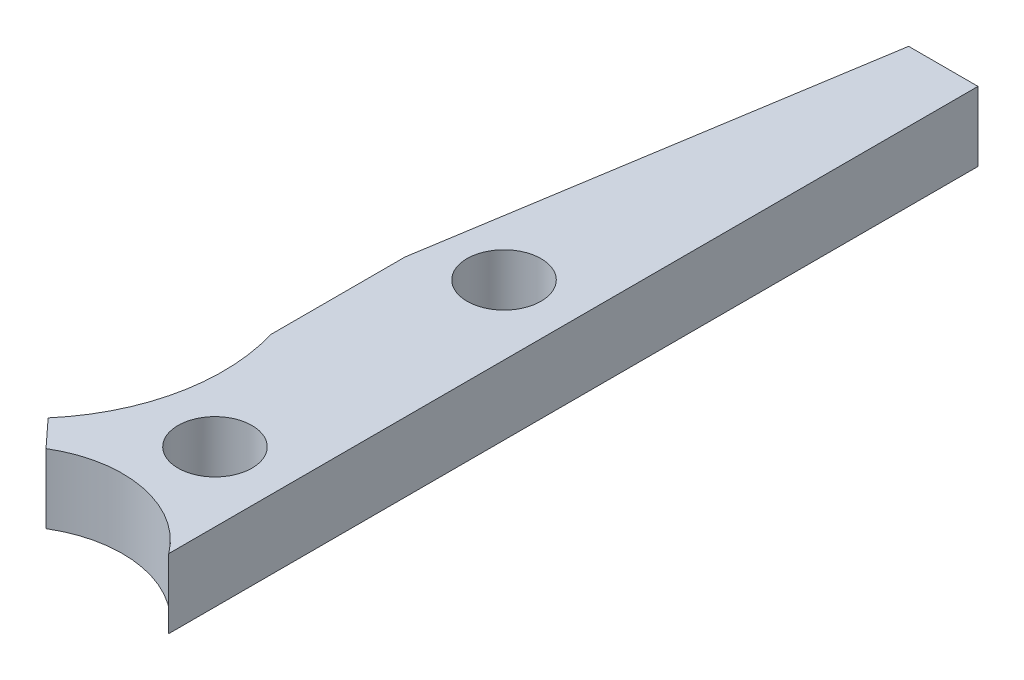
ISO-10303-21;
HEADER;
FILE_DESCRIPTION(('STEP AP214'),'2;1');
FILE_NAME('part.step','',(''),(''),'','','');
FILE_SCHEMA(('AUTOMOTIVE_DESIGN { 1 0 10303 214 1 1 1 1 }'));
ENDSEC;
DATA;
#1=APPLICATION_CONTEXT('core data for automotive mechanical design processes');
#2=APPLICATION_PROTOCOL_DEFINITION('international standard','automotive_design',2000,#1);
#3=PRODUCT_CONTEXT('',#1,'mechanical');
#4=PRODUCT('Part','Part','',(#3));
#5=PRODUCT_RELATED_PRODUCT_CATEGORY('part','',(#4));
#6=PRODUCT_DEFINITION_FORMATION('','',#4);
#7=PRODUCT_DEFINITION_CONTEXT('part definition',#1,'design');
#8=PRODUCT_DEFINITION('design','',#6,#7);
#9=PRODUCT_DEFINITION_SHAPE('','',#8);
#10=(LENGTH_UNIT() NAMED_UNIT(*) SI_UNIT(.MILLI.,.METRE.));
#11=(NAMED_UNIT(*) PLANE_ANGLE_UNIT() SI_UNIT($,.RADIAN.));
#12=(NAMED_UNIT(*) SI_UNIT($,.STERADIAN.) SOLID_ANGLE_UNIT());
#13=UNCERTAINTY_MEASURE_WITH_UNIT(LENGTH_MEASURE(1.E-05),#10,'distance_accuracy_value','');
#14=(GEOMETRIC_REPRESENTATION_CONTEXT(3) GLOBAL_UNCERTAINTY_ASSIGNED_CONTEXT((#13)) GLOBAL_UNIT_ASSIGNED_CONTEXT((#10,
#11,#12)) REPRESENTATION_CONTEXT('',''));
#15=CARTESIAN_POINT('',(0.,0.,0.));
#16=DIRECTION('',(0.,0.,1.));
#17=DIRECTION('',(1.,0.,0.));
#18=AXIS2_PLACEMENT_3D('',#15,#16,#17);
#19=CARTESIAN_POINT('',(0.,0.,0.));
#20=DIRECTION('',(0.,1.,0.));
#21=DIRECTION('',(1.,0.,0.));
#22=AXIS2_PLACEMENT_3D('',#19,#20,#21);
#23=PLANE('',#22);
#24=DIRECTION('',(0.,0.,-1.));
#25=VECTOR('',#24,1.);
#26=CARTESIAN_POINT('',(8.15,0.,-2.414021540915));
#27=LINE('',#26,#25);
#28=CARTESIAN_POINT('',(8.15,0.,-2.414021540915));
#29=VERTEX_POINT('',#28);
#30=CARTESIAN_POINT('',(8.15,0.,-8.219053391277));
#31=VERTEX_POINT('',#30);
#32=EDGE_CURVE('E11',#29,#31,#27,.T.);
#33=ORIENTED_EDGE('',*,*,#32,.T.);
#34=DIRECTION('',(-0.157736652180697,0.,0.98748121428148));
#35=VECTOR('',#34,1.);
#36=CARTESIAN_POINT('',(11.15,0.,-27.));
#37=LINE('',#36,#35);
#38=CARTESIAN_POINT('',(11.15,0.,-27.));
#39=VERTEX_POINT('',#38);
#40=EDGE_CURVE('E36',#39,#31,#37,.T.);
#41=ORIENTED_EDGE('',*,*,#40,.F.);
#42=DIRECTION('',(-1.,0.,0.));
#43=VECTOR('',#42,1.);
#44=CARTESIAN_POINT('',(14.15,0.,-27.));
#45=LINE('',#44,#43);
#46=CARTESIAN_POINT('',(14.15,0.,-27.));
#47=VERTEX_POINT('',#46);
#48=EDGE_CURVE('E105',#47,#39,#45,.T.);
#49=ORIENTED_EDGE('',*,*,#48,.F.);
#50=DIRECTION('',(0.,0.,-1.));
#51=VECTOR('',#50,1.);
#52=CARTESIAN_POINT('',(14.15,0.,8.));
#53=LINE('',#52,#51);
#54=CARTESIAN_POINT('',(14.15,0.,8.));
#55=VERTEX_POINT('',#54);
#56=EDGE_CURVE('E108',#55,#47,#53,.T.);
#57=ORIENTED_EDGE('',*,*,#56,.F.);
#58=CARTESIAN_POINT('',(10.15,0.,11.));
#59=DIRECTION('',(0.,1.,0.));
#60=DIRECTION('',(0.8,0.,-0.6));
#61=AXIS2_PLACEMENT_3D('',#58,#59,#60);
#62=CIRCLE('',#61,5.);
#63=CARTESIAN_POINT('',(7.56273097412,0.,6.721444287178));
#64=VERTEX_POINT('',#63);
#65=EDGE_CURVE('E27',#55,#64,#62,.T.);
#66=ORIENTED_EDGE('',*,*,#65,.T.);
#67=DIRECTION('',(-0.678141343769995,0.,-0.734931505563495));
#68=VECTOR('',#67,1.);
#69=CARTESIAN_POINT('',(7.56273097412,0.,6.721444287178));
#70=LINE('',#69,#68);
#71=CARTESIAN_POINT('',(6.459103266768,0.,5.525394555073));
#72=VERTEX_POINT('',#71);
#73=EDGE_CURVE('E145',#64,#72,#70,.T.);
#74=ORIENTED_EDGE('',*,*,#73,.T.);
#75=CARTESIAN_POINT('',(0.,0.,0.));
#76=DIRECTION('',(0.,1.,0.));
#77=DIRECTION('',(0.759894501972726,0.,0.650046418243822));
#78=AXIS2_PLACEMENT_3D('',#75,#76,#77);
#79=CIRCLE('',#78,8.5);
#80=EDGE_CURVE('E142',#72,#29,#79,.T.);
#81=ORIENTED_EDGE('',*,*,#80,.T.);
#82=EDGE_LOOP('',(#33,#41,#49,#57,#66,#74,#81));
#83=FACE_BOUND('',#82,.T.);
#84=CARTESIAN_POINT('',(11.15,0.,3.));
#85=DIRECTION('',(0.,-1.,0.));
#86=DIRECTION('',(-1.,0.,0.));
#87=AXIS2_PLACEMENT_3D('',#84,#85,#86);
#88=CIRCLE('',#87,1.6);
#89=CARTESIAN_POINT('',(9.55,0.,3.));
#90=VERTEX_POINT('',#89);
#91=EDGE_CURVE('E126',#90,#90,#88,.T.);
#92=ORIENTED_EDGE('',*,*,#91,.F.);
#93=EDGE_LOOP('',(#92));
#94=FACE_BOUND('',#93,.T.);
#95=CARTESIAN_POINT('',(11.15,0.,-9.5));
#96=DIRECTION('',(0.,-1.,0.));
#97=DIRECTION('',(-1.,0.,0.));
#98=AXIS2_PLACEMENT_3D('',#95,#96,#97);
#99=CIRCLE('',#98,1.6);
#100=CARTESIAN_POINT('',(9.55,0.,-9.5));
#101=VERTEX_POINT('',#100);
#102=EDGE_CURVE('E92',#101,#101,#99,.T.);
#103=ORIENTED_EDGE('',*,*,#102,.F.);
#104=EDGE_LOOP('',(#103));
#105=FACE_BOUND('',#104,.T.);
#106=ADVANCED_FACE('F17',(#83,#94,#105),#23,.F.);
#107=CARTESIAN_POINT('',(11.15,3.,3.));
#108=DIRECTION('',(0.,-1.,0.));
#109=DIRECTION('',(1.,0.,0.));
#110=AXIS2_PLACEMENT_3D('',#107,#108,#109);
#111=CYLINDRICAL_SURFACE('',#110,1.6);
#112=ORIENTED_EDGE('',*,*,#91,.T.);
#113=EDGE_LOOP('',(#112));
#114=FACE_BOUND('',#113,.T.);
#115=CARTESIAN_POINT('',(11.15,3.,3.));
#116=DIRECTION('',(0.,-1.,0.));
#117=DIRECTION('',(1.,0.,0.));
#118=AXIS2_PLACEMENT_3D('',#115,#116,#117);
#119=CIRCLE('',#118,1.6);
#120=CARTESIAN_POINT('',(12.75,3.,3.));
#121=VERTEX_POINT('',#120);
#122=EDGE_CURVE('E129',#121,#121,#119,.T.);
#123=ORIENTED_EDGE('',*,*,#122,.F.);
#124=EDGE_LOOP('',(#123));
#125=FACE_BOUND('',#124,.T.);
#126=ADVANCED_FACE('F170',(#114,#125),#111,.F.);
#127=CARTESIAN_POINT('',(0.,3.,0.));
#128=DIRECTION('',(0.,1.,0.));
#129=DIRECTION('',(1.,0.,0.));
#130=AXIS2_PLACEMENT_3D('',#127,#128,#129);
#131=PLANE('',#130);
#132=DIRECTION('',(-0.678141343769995,0.,-0.734931505563495));
#133=VECTOR('',#132,1.);
#134=CARTESIAN_POINT('',(7.56273097412,3.,6.721444287178));
#135=LINE('',#134,#133);
#136=CARTESIAN_POINT('',(7.56273097412,3.,6.721444287178));
#137=VERTEX_POINT('',#136);
#138=CARTESIAN_POINT('',(6.459103266768,3.,5.525394555073));
#139=VERTEX_POINT('',#138);
#140=EDGE_CURVE('E119',#137,#139,#135,.T.);
#141=ORIENTED_EDGE('',*,*,#140,.F.);
#142=CARTESIAN_POINT('',(10.15,3.,11.));
#143=DIRECTION('',(0.,1.,0.));
#144=DIRECTION('',(0.8,0.,-0.6));
#145=AXIS2_PLACEMENT_3D('',#142,#143,#144);
#146=CIRCLE('',#145,5.);
#147=CARTESIAN_POINT('',(14.15,3.,8.));
#148=VERTEX_POINT('',#147);
#149=EDGE_CURVE('E111',#148,#137,#146,.T.);
#150=ORIENTED_EDGE('',*,*,#149,.F.);
#151=DIRECTION('',(0.,0.,-1.));
#152=VECTOR('',#151,1.);
#153=CARTESIAN_POINT('',(14.15,3.,8.));
#154=LINE('',#153,#152);
#155=CARTESIAN_POINT('',(14.15,3.,-27.));
#156=VERTEX_POINT('',#155);
#157=EDGE_CURVE('E123',#148,#156,#154,.T.);
#158=ORIENTED_EDGE('',*,*,#157,.T.);
#159=DIRECTION('',(-1.,0.,0.));
#160=VECTOR('',#159,1.);
#161=CARTESIAN_POINT('',(14.15,3.,-27.));
#162=LINE('',#161,#160);
#163=CARTESIAN_POINT('',(11.15,3.,-27.));
#164=VERTEX_POINT('',#163);
#165=EDGE_CURVE('E127',#156,#164,#162,.T.);
#166=ORIENTED_EDGE('',*,*,#165,.T.);
#167=DIRECTION('',(-0.157736652180697,0.,0.98748121428148));
#168=VECTOR('',#167,1.);
#169=CARTESIAN_POINT('',(11.15,3.,-27.));
#170=LINE('',#169,#168);
#171=CARTESIAN_POINT('',(8.15,3.,-8.219053391277));
#172=VERTEX_POINT('',#171);
#173=EDGE_CURVE('E84',#164,#172,#170,.T.);
#174=ORIENTED_EDGE('',*,*,#173,.T.);
#175=DIRECTION('',(0.,0.,-1.));
#176=VECTOR('',#175,1.);
#177=CARTESIAN_POINT('',(8.15,3.,-2.414021540915));
#178=LINE('',#177,#176);
#179=CARTESIAN_POINT('',(8.15,3.,-2.414021540915));
#180=VERTEX_POINT('',#179);
#181=EDGE_CURVE('E74',#180,#172,#178,.T.);
#182=ORIENTED_EDGE('',*,*,#181,.F.);
#183=CARTESIAN_POINT('',(0.,3.,0.));
#184=DIRECTION('',(0.,1.,0.));
#185=DIRECTION('',(0.759894501972726,0.,0.650046418243822));
#186=AXIS2_PLACEMENT_3D('',#183,#184,#185);
#187=CIRCLE('',#186,8.5);
#188=EDGE_CURVE('E81',#139,#180,#187,.T.);
#189=ORIENTED_EDGE('',*,*,#188,.F.);
#190=EDGE_LOOP('',(#141,#150,#158,#166,#174,#182,#189));
#191=FACE_BOUND('',#190,.T.);
#192=ORIENTED_EDGE('',*,*,#122,.T.);
#193=EDGE_LOOP('',(#192));
#194=FACE_BOUND('',#193,.T.);
#195=CARTESIAN_POINT('',(11.15,3.,-9.5));
#196=DIRECTION('',(0.,-1.,0.));
#197=DIRECTION('',(-1.,0.,0.));
#198=AXIS2_PLACEMENT_3D('',#195,#196,#197);
#199=CIRCLE('',#198,1.6);
#200=CARTESIAN_POINT('',(9.55,3.,-9.5));
#201=VERTEX_POINT('',#200);
#202=EDGE_CURVE('E130',#201,#201,#199,.T.);
#203=ORIENTED_EDGE('',*,*,#202,.T.);
#204=EDGE_LOOP('',(#203));
#205=FACE_BOUND('',#204,.T.);
#206=ADVANCED_FACE('F79',(#191,#194,#205),#131,.T.);
#207=CARTESIAN_POINT('',(11.15,3.,-9.5));
#208=DIRECTION('',(0.,-1.,0.));
#209=DIRECTION('',(1.,0.,0.));
#210=AXIS2_PLACEMENT_3D('',#207,#208,#209);
#211=CYLINDRICAL_SURFACE('',#210,1.6);
#212=ORIENTED_EDGE('',*,*,#102,.T.);
#213=EDGE_LOOP('',(#212));
#214=FACE_BOUND('',#213,.T.);
#215=ORIENTED_EDGE('',*,*,#202,.F.);
#216=EDGE_LOOP('',(#215));
#217=FACE_BOUND('',#216,.T.);
#218=ADVANCED_FACE('F180',(#214,#217),#211,.F.);
#219=CARTESIAN_POINT('',(0.,3.,0.));
#220=DIRECTION('',(0.,1.,0.));
#221=DIRECTION('',(1.,0.,0.));
#222=AXIS2_PLACEMENT_3D('',#219,#220,#221);
#223=CYLINDRICAL_SURFACE('',#222,8.5);
#224=DIRECTION('',(0.,-1.,0.));
#225=VECTOR('',#224,1.);
#226=CARTESIAN_POINT('',(6.459103266768,3.,5.525394555073));
#227=LINE('',#226,#225);
#228=EDGE_CURVE('E91',#139,#72,#227,.T.);
#229=ORIENTED_EDGE('',*,*,#228,.F.);
#230=ORIENTED_EDGE('',*,*,#188,.T.);
#231=DIRECTION('',(0.,-1.,0.));
#232=VECTOR('',#231,1.);
#233=CARTESIAN_POINT('',(8.15,3.,-2.414021540915));
#234=LINE('',#233,#232);
#235=EDGE_CURVE('E85',#180,#29,#234,.T.);
#236=ORIENTED_EDGE('',*,*,#235,.T.);
#237=ORIENTED_EDGE('',*,*,#80,.F.);
#238=EDGE_LOOP('',(#229,#230,#236,#237));
#239=FACE_BOUND('',#238,.T.);
#240=ADVANCED_FACE('F89',(#239),#223,.F.);
#241=CARTESIAN_POINT('',(8.15,3.,-2.414021540915));
#242=DIRECTION('',(1.,0.,0.));
#243=DIRECTION('',(0.,0.,-1.));
#244=AXIS2_PLACEMENT_3D('',#241,#242,#243);
#245=PLANE('',#244);
#246=ORIENTED_EDGE('',*,*,#235,.F.);
#247=ORIENTED_EDGE('',*,*,#181,.T.);
#248=DIRECTION('',(0.,1.,0.));
#249=VECTOR('',#248,1.);
#250=CARTESIAN_POINT('',(8.15,0.,-8.219053391277));
#251=LINE('',#250,#249);
#252=EDGE_CURVE('E100',#31,#172,#251,.T.);
#253=ORIENTED_EDGE('',*,*,#252,.F.);
#254=ORIENTED_EDGE('',*,*,#32,.F.);
#255=EDGE_LOOP('',(#246,#247,#253,#254));
#256=FACE_BOUND('',#255,.T.);
#257=ADVANCED_FACE('F95',(#256),#245,.F.);
#258=CARTESIAN_POINT('',(11.15,0.,-27.));
#259=DIRECTION('',(-0.98748121428148,0.,-0.157736652180697));
#260=DIRECTION('',(-0.157736652180697,0.,0.98748121428148));
#261=AXIS2_PLACEMENT_3D('',#258,#259,#260);
#262=PLANE('',#261);
#263=ORIENTED_EDGE('',*,*,#173,.F.);
#264=DIRECTION('',(0.,1.,0.));
#265=VECTOR('',#264,1.);
#266=CARTESIAN_POINT('',(11.15,0.,-27.));
#267=LINE('',#266,#265);
#268=EDGE_CURVE('E102',#39,#164,#267,.T.);
#269=ORIENTED_EDGE('',*,*,#268,.F.);
#270=ORIENTED_EDGE('',*,*,#40,.T.);
#271=ORIENTED_EDGE('',*,*,#252,.T.);
#272=EDGE_LOOP('',(#263,#269,#270,#271));
#273=FACE_BOUND('',#272,.T.);
#274=ADVANCED_FACE('F158',(#273),#262,.T.);
#275=CARTESIAN_POINT('',(14.15,0.,-27.));
#276=DIRECTION('',(0.,0.,-1.));
#277=DIRECTION('',(-1.,0.,0.));
#278=AXIS2_PLACEMENT_3D('',#275,#276,#277);
#279=PLANE('',#278);
#280=ORIENTED_EDGE('',*,*,#268,.T.);
#281=ORIENTED_EDGE('',*,*,#165,.F.);
#282=DIRECTION('',(0.,1.,0.));
#283=VECTOR('',#282,1.);
#284=CARTESIAN_POINT('',(14.15,0.,-27.));
#285=LINE('',#284,#283);
#286=EDGE_CURVE('E106',#47,#156,#285,.T.);
#287=ORIENTED_EDGE('',*,*,#286,.F.);
#288=ORIENTED_EDGE('',*,*,#48,.T.);
#289=EDGE_LOOP('',(#280,#281,#287,#288));
#290=FACE_BOUND('',#289,.T.);
#291=ADVANCED_FACE('F155',(#290),#279,.T.);
#292=CARTESIAN_POINT('',(14.15,0.,11.));
#293=DIRECTION('',(1.,0.,0.));
#294=DIRECTION('',(0.,0.,-1.));
#295=AXIS2_PLACEMENT_3D('',#292,#293,#294);
#296=PLANE('',#295);
#297=ORIENTED_EDGE('',*,*,#56,.T.);
#298=ORIENTED_EDGE('',*,*,#286,.T.);
#299=ORIENTED_EDGE('',*,*,#157,.F.);
#300=DIRECTION('',(0.,1.,0.));
#301=VECTOR('',#300,1.);
#302=CARTESIAN_POINT('',(14.15,0.,8.));
#303=LINE('',#302,#301);
#304=EDGE_CURVE('E109',#55,#148,#303,.T.);
#305=ORIENTED_EDGE('',*,*,#304,.F.);
#306=EDGE_LOOP('',(#297,#298,#299,#305));
#307=FACE_BOUND('',#306,.T.);
#308=ADVANCED_FACE('F161',(#307),#296,.T.);
#309=CARTESIAN_POINT('',(10.15,3.,11.));
#310=DIRECTION('',(0.,1.,0.));
#311=DIRECTION('',(1.,0.,0.));
#312=AXIS2_PLACEMENT_3D('',#309,#310,#311);
#313=CYLINDRICAL_SURFACE('',#312,5.);
#314=ORIENTED_EDGE('',*,*,#304,.T.);
#315=ORIENTED_EDGE('',*,*,#149,.T.);
#316=DIRECTION('',(0.,-1.,0.));
#317=VECTOR('',#316,1.);
#318=CARTESIAN_POINT('',(7.56273097412,3.,6.721444287178));
#319=LINE('',#318,#317);
#320=EDGE_CURVE('E21',#137,#64,#319,.T.);
#321=ORIENTED_EDGE('',*,*,#320,.T.);
#322=ORIENTED_EDGE('',*,*,#65,.F.);
#323=EDGE_LOOP('',(#314,#315,#321,#322));
#324=FACE_BOUND('',#323,.T.);
#325=ADVANCED_FACE('F162',(#324),#313,.F.);
#326=CARTESIAN_POINT('',(7.56273097412,3.,6.721444287178));
#327=DIRECTION('',(0.734931505563495,0.,-0.678141343769995));
#328=DIRECTION('',(-0.678141343769995,0.,-0.734931505563495));
#329=AXIS2_PLACEMENT_3D('',#326,#327,#328);
#330=PLANE('',#329);
#331=ORIENTED_EDGE('',*,*,#320,.F.);
#332=ORIENTED_EDGE('',*,*,#140,.T.);
#333=ORIENTED_EDGE('',*,*,#228,.T.);
#334=ORIENTED_EDGE('',*,*,#73,.F.);
#335=EDGE_LOOP('',(#331,#332,#333,#334));
#336=FACE_BOUND('',#335,.T.);
#337=ADVANCED_FACE('F19',(#336),#330,.F.);
#338=CLOSED_SHELL('',(#106,#126,#206,#218,#240,#257,#274,#291,#308,#325,#337));
#339=MANIFOLD_SOLID_BREP('B1',#338);
#340=ADVANCED_BREP_SHAPE_REPRESENTATION('',(#18,#339),#14);
#341=SHAPE_DEFINITION_REPRESENTATION(#9,#340);
ENDSEC;
END-ISO-10303-21;
